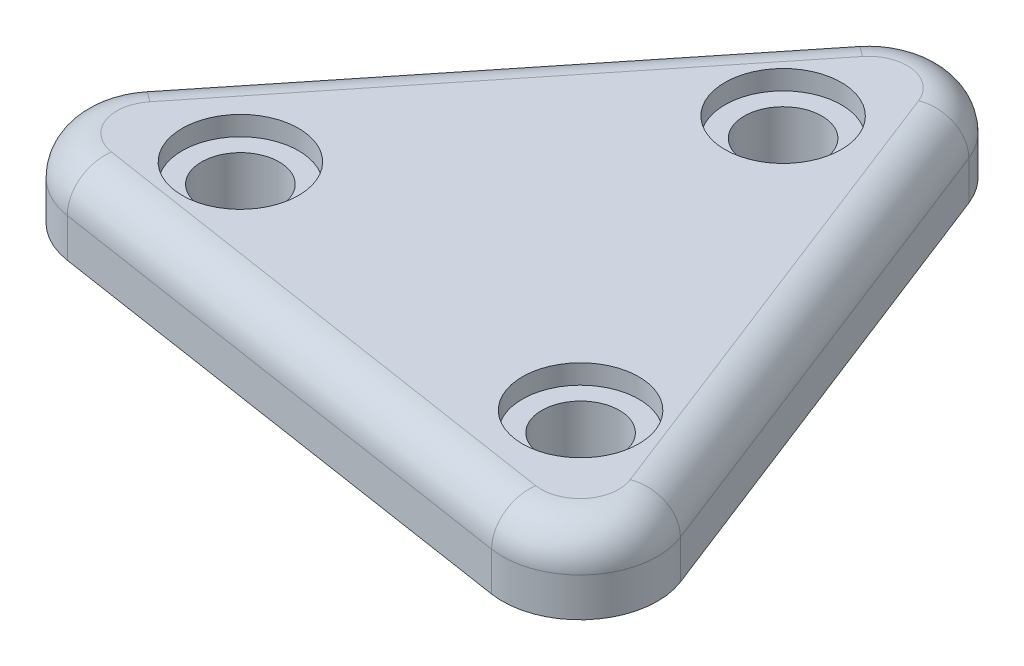
ISO-10303-21;
HEADER;
FILE_DESCRIPTION(('STEP AP214'),'2;1');
FILE_NAME('part.step','',(''),(''),'','','');
FILE_SCHEMA(('AUTOMOTIVE_DESIGN { 1 0 10303 214 1 1 1 1 }'));
ENDSEC;
DATA;
#1=APPLICATION_CONTEXT('core data for automotive mechanical design processes');
#2=APPLICATION_PROTOCOL_DEFINITION('international standard','automotive_design',2000,#1);
#3=PRODUCT_CONTEXT('',#1,'mechanical');
#4=PRODUCT('Part','Part','',(#3));
#5=PRODUCT_RELATED_PRODUCT_CATEGORY('part','',(#4));
#6=PRODUCT_DEFINITION_FORMATION('','',#4);
#7=PRODUCT_DEFINITION_CONTEXT('part definition',#1,'design');
#8=PRODUCT_DEFINITION('design','',#6,#7);
#9=PRODUCT_DEFINITION_SHAPE('','',#8);
#10=(LENGTH_UNIT() NAMED_UNIT(*) SI_UNIT(.MILLI.,.METRE.));
#11=(NAMED_UNIT(*) PLANE_ANGLE_UNIT() SI_UNIT($,.RADIAN.));
#12=(NAMED_UNIT(*) SI_UNIT($,.STERADIAN.) SOLID_ANGLE_UNIT());
#13=UNCERTAINTY_MEASURE_WITH_UNIT(LENGTH_MEASURE(1.E-05),#10,'distance_accuracy_value','');
#14=(GEOMETRIC_REPRESENTATION_CONTEXT(3) GLOBAL_UNCERTAINTY_ASSIGNED_CONTEXT((#13)) GLOBAL_UNIT_ASSIGNED_CONTEXT((#10,
#11,#12)) REPRESENTATION_CONTEXT('',''));
#15=CARTESIAN_POINT('',(0.,0.,0.));
#16=DIRECTION('',(0.,0.,1.));
#17=DIRECTION('',(1.,0.,0.));
#18=AXIS2_PLACEMENT_3D('',#15,#16,#17);
#19=CARTESIAN_POINT('',(0.670392161956381,2.,-5.7344492048078));
#20=DIRECTION('',(0.,-1.,0.));
#21=DIRECTION('',(0.,0.,-1.));
#22=AXIS2_PLACEMENT_3D('',#19,#20,#21);
#23=CYLINDRICAL_SURFACE('',#22,1.);
#24=CARTESIAN_POINT('',(0.670392161956381,0.,-5.7344492048078));
#25=DIRECTION('',(0.,1.,0.));
#26=DIRECTION('',(0.,0.,1.));
#27=AXIS2_PLACEMENT_3D('',#24,#25,#26);
#28=CIRCLE('',#27,1.);
#29=CARTESIAN_POINT('',(0.670392161956381,0.,-4.7344492048078));
#30=VERTEX_POINT('',#29);
#31=EDGE_CURVE('E140',#30,#30,#28,.T.);
#32=ORIENTED_EDGE('',*,*,#31,.F.);
#33=EDGE_LOOP('',(#32));
#34=FACE_BOUND('',#33,.T.);
#35=CARTESIAN_POINT('',(0.670392161956381,1.5,-5.7344492048078));
#36=DIRECTION('',(0.,1.,0.));
#37=DIRECTION('',(0.,0.,1.));
#38=AXIS2_PLACEMENT_3D('',#35,#36,#37);
#39=CIRCLE('',#38,1.);
#40=CARTESIAN_POINT('',(0.670392161956381,1.5,-4.7344492048078));
#41=VERTEX_POINT('',#40);
#42=EDGE_CURVE('E38',#41,#41,#39,.T.);
#43=ORIENTED_EDGE('',*,*,#42,.T.);
#44=EDGE_LOOP('',(#43));
#45=FACE_BOUND('',#44,.T.);
#46=ADVANCED_FACE('F34',(#34,#45),#23,.F.);
#47=CARTESIAN_POINT('',(4.63098260709683,2.,3.44780124515609));
#48=DIRECTION('',(0.,-1.,0.));
#49=DIRECTION('',(0.,0.,-1.));
#50=AXIS2_PLACEMENT_3D('',#47,#48,#49);
#51=CYLINDRICAL_SURFACE('',#50,1.);
#52=CARTESIAN_POINT('',(4.63098260709683,0.,3.44780124515609));
#53=DIRECTION('',(0.,1.,0.));
#54=DIRECTION('',(0.,0.,1.));
#55=AXIS2_PLACEMENT_3D('',#52,#53,#54);
#56=CIRCLE('',#55,1.);
#57=CARTESIAN_POINT('',(4.63098260709683,0.,4.44780124515609));
#58=VERTEX_POINT('',#57);
#59=EDGE_CURVE('E229',#58,#58,#56,.T.);
#60=ORIENTED_EDGE('',*,*,#59,.F.);
#61=EDGE_LOOP('',(#60));
#62=FACE_BOUND('',#61,.T.);
#63=CARTESIAN_POINT('',(4.63098260709683,1.5,3.44780124515609));
#64=DIRECTION('',(0.,1.,0.));
#65=DIRECTION('',(0.,0.,1.));
#66=AXIS2_PLACEMENT_3D('',#63,#64,#65);
#67=CIRCLE('',#66,1.);
#68=CARTESIAN_POINT('',(4.63098260709683,1.5,4.44780124515609));
#69=VERTEX_POINT('',#68);
#70=EDGE_CURVE('E193',#69,#69,#67,.T.);
#71=ORIENTED_EDGE('',*,*,#70,.T.);
#72=EDGE_LOOP('',(#71));
#73=FACE_BOUND('',#72,.T.);
#74=ADVANCED_FACE('F236',(#62,#73),#51,.F.);
#75=CARTESIAN_POINT('',(-5.30137476905322,2.,2.2866479596517));
#76=DIRECTION('',(0.,-1.,0.));
#77=DIRECTION('',(0.,0.,-1.));
#78=AXIS2_PLACEMENT_3D('',#75,#76,#77);
#79=CYLINDRICAL_SURFACE('',#78,1.);
#80=CARTESIAN_POINT('',(-5.30137476905322,0.,2.2866479596517));
#81=DIRECTION('',(0.,1.,0.));
#82=DIRECTION('',(0.,0.,1.));
#83=AXIS2_PLACEMENT_3D('',#80,#81,#82);
#84=CIRCLE('',#83,1.);
#85=CARTESIAN_POINT('',(-5.30137476905322,0.,3.2866479596517));
#86=VERTEX_POINT('',#85);
#87=EDGE_CURVE('E190',#86,#86,#84,.T.);
#88=ORIENTED_EDGE('',*,*,#87,.F.);
#89=EDGE_LOOP('',(#88));
#90=FACE_BOUND('',#89,.T.);
#91=CARTESIAN_POINT('',(-5.30137476905322,1.5,2.2866479596517));
#92=DIRECTION('',(0.,1.,0.));
#93=DIRECTION('',(0.,0.,1.));
#94=AXIS2_PLACEMENT_3D('',#91,#92,#93);
#95=CIRCLE('',#94,1.);
#96=CARTESIAN_POINT('',(-5.30137476905322,1.5,3.2866479596517));
#97=VERTEX_POINT('',#96);
#98=EDGE_CURVE('E191',#97,#97,#95,.T.);
#99=ORIENTED_EDGE('',*,*,#98,.T.);
#100=EDGE_LOOP('',(#99));
#101=FACE_BOUND('',#100,.T.);
#102=ADVANCED_FACE('F241',(#90,#101),#79,.F.);
#103=CARTESIAN_POINT('',(0.,2.,0.));
#104=DIRECTION('',(0.,1.,0.));
#105=DIRECTION('',(0.,0.,1.));
#106=AXIS2_PLACEMENT_3D('',#103,#104,#105);
#107=PLANE('',#106);
#108=CARTESIAN_POINT('',(0.670392161956381,2.,-5.7344492048078));
#109=DIRECTION('',(0.,1.,0.));
#110=DIRECTION('',(0.,0.,1.));
#111=AXIS2_PLACEMENT_3D('',#108,#109,#110);
#112=CIRCLE('',#111,1.5);
#113=CARTESIAN_POINT('',(0.670392161956381,2.,-4.2344492048078));
#114=VERTEX_POINT('',#113);
#115=EDGE_CURVE('E210',#114,#114,#112,.T.);
#116=ORIENTED_EDGE('',*,*,#115,.F.);
#117=EDGE_LOOP('',(#116));
#118=FACE_BOUND('',#117,.T.);
#119=CARTESIAN_POINT('',(-5.30137476905322,2.,2.2866479596517));
#120=DIRECTION('',(0.,1.,0.));
#121=DIRECTION('',(0.,0.,1.));
#122=AXIS2_PLACEMENT_3D('',#119,#120,#121);
#123=CIRCLE('',#122,1.5);
#124=CARTESIAN_POINT('',(-5.30137476905322,2.,3.7866479596517));
#125=VERTEX_POINT('',#124);
#126=EDGE_CURVE('E218',#125,#125,#123,.T.);
#127=ORIENTED_EDGE('',*,*,#126,.F.);
#128=EDGE_LOOP('',(#127));
#129=FACE_BOUND('',#128,.T.);
#130=CARTESIAN_POINT('',(4.63098260709683,2.,3.44780124515609));
#131=DIRECTION('',(0.,1.,0.));
#132=DIRECTION('',(0.,0.,1.));
#133=AXIS2_PLACEMENT_3D('',#130,#131,#132);
#134=CIRCLE('',#133,1.5);
#135=CARTESIAN_POINT('',(4.63098260709683,2.,4.94780124515609));
#136=VERTEX_POINT('',#135);
#137=EDGE_CURVE('E224',#136,#136,#134,.T.);
#138=ORIENTED_EDGE('',*,*,#137,.F.);
#139=EDGE_LOOP('',(#138));
#140=FACE_BOUND('',#139,.T.);
#141=DIRECTION('',(-0.625491512786433,0.,0.780230970567139));
#142=VECTOR('',#141,1.);
#143=CARTESIAN_POINT('',(-7.81258360646896,2.,2.11372492030497));
#144=LINE('',#143,#142);
#145=CARTESIAN_POINT('',(0.363714329862823,2.,-8.08529576039356));
#146=VERTEX_POINT('',#145);
#147=CARTESIAN_POINT('',(-7.81258360646896,2.,2.11372492030497));
#148=VERTEX_POINT('',#147);
#149=EDGE_CURVE('E161',#146,#148,#144,.T.);
#150=ORIENTED_EDGE('',*,*,#149,.T.);
#151=CARTESIAN_POINT('',(-7.03235263590182,2.,2.7392164330914));
#152=DIRECTION('',(0.,1.,0.));
#153=DIRECTION('',(0.,0.,1.));
#154=AXIS2_PLACEMENT_3D('',#151,#152,#153);
#155=CIRCLE('',#154,1.);
#156=CARTESIAN_POINT('',(-7.18392869054286,2.,3.72766203081515));
#157=VERTEX_POINT('',#156);
#158=EDGE_CURVE('E163',#148,#157,#155,.T.);
#159=ORIENTED_EDGE('',*,*,#158,.T.);
#160=DIRECTION('',(0.988445597723748,0.,0.15157605464104));
#161=VECTOR('',#160,1.);
#162=CARTESIAN_POINT('',(5.73683128083081,2.,5.70903341223948));
#163=LINE('',#162,#161);
#164=CARTESIAN_POINT('',(5.73683128083081,2.,5.70903341223948));
#165=VERTEX_POINT('',#164);
#166=EDGE_CURVE('E153',#157,#165,#163,.T.);
#167=ORIENTED_EDGE('',*,*,#166,.T.);
#168=CARTESIAN_POINT('',(5.88840733547185,2.,4.72058781451573));
#169=DIRECTION('',(0.,1.,0.));
#170=DIRECTION('',(0.,0.,1.));
#171=AXIS2_PLACEMENT_3D('',#168,#169,#170);
#172=CIRCLE('',#171,1.);
#173=CARTESIAN_POINT('',(6.82021436068003,2.,4.35763372957842));
#174=VERTEX_POINT('',#173);
#175=EDGE_CURVE('E155',#165,#174,#172,.T.);
#176=ORIENTED_EDGE('',*,*,#175,.T.);
#177=DIRECTION('',(-0.362954084937314,0.,-0.93180702520818));
#178=VECTOR('',#177,1.);
#179=CARTESIAN_POINT('',(2.07575232563814,2.,-7.82275833254444));
#180=LINE('',#179,#178);
#181=CARTESIAN_POINT('',(2.07575232563814,2.,-7.82275833254444));
#182=VERTEX_POINT('',#181);
#183=EDGE_CURVE('E157',#174,#182,#180,.T.);
#184=ORIENTED_EDGE('',*,*,#183,.T.);
#185=CARTESIAN_POINT('',(1.14394530042996,2.,-7.45980424760713));
#186=DIRECTION('',(0.,1.,0.));
#187=DIRECTION('',(0.,0.,1.));
#188=AXIS2_PLACEMENT_3D('',#185,#186,#187);
#189=CIRCLE('',#188,1.);
#190=EDGE_CURVE('E159',#182,#146,#189,.T.);
#191=ORIENTED_EDGE('',*,*,#190,.T.);
#192=EDGE_LOOP('',(#150,#159,#167,#176,#184,#191));
#193=FACE_BOUND('',#192,.T.);
#194=ADVANCED_FACE('F246',(#118,#129,#140,#193),#107,.T.);
#195=CARTESIAN_POINT('',(0.,0.,0.));
#196=DIRECTION('',(0.,1.,0.));
#197=DIRECTION('',(0.,0.,1.));
#198=AXIS2_PLACEMENT_3D('',#195,#196,#197);
#199=PLANE('',#198);
#200=DIRECTION('',(-0.625491512786433,0.,0.780230970567139));
#201=VECTOR('',#200,1.);
#202=CARTESIAN_POINT('',(1.75024951899413,0.,-11.4135866385021));
#203=LINE('',#202,#201);
#204=CARTESIAN_POINT('',(-0.416516640704316,0.,-8.71078727317999));
#205=VERTEX_POINT('',#204);
#206=CARTESIAN_POINT('',(-8.5928145770361,0.,1.48823340751853));
#207=VERTEX_POINT('',#206);
#208=EDGE_CURVE('E112',#205,#207,#203,.T.);
#209=ORIENTED_EDGE('',*,*,#208,.F.);
#210=CARTESIAN_POINT('',(1.14394530042996,0.,-7.45980424760713));
#211=DIRECTION('',(0.,1.,0.));
#212=DIRECTION('',(0.,0.,1.));
#213=AXIS2_PLACEMENT_3D('',#210,#211,#212);
#214=CIRCLE('',#213,2.);
#215=CARTESIAN_POINT('',(3.00755935084632,0.,-8.18571241748175));
#216=VERTEX_POINT('',#215);
#217=EDGE_CURVE('E122',#205,#216,#214,.F.);
#218=ORIENTED_EDGE('',*,*,#217,.T.);
#219=DIRECTION('',(-0.362954084937314,0.,-0.93180702520818));
#220=VECTOR('',#219,1.);
#221=CARTESIAN_POINT('',(9.0093312177404,0.,7.22255386566146));
#222=LINE('',#221,#220);
#223=CARTESIAN_POINT('',(7.75202138588821,0.,3.9946796446411));
#224=VERTEX_POINT('',#223);
#225=EDGE_CURVE('E136',#224,#216,#222,.T.);
#226=ORIENTED_EDGE('',*,*,#225,.F.);
#227=CARTESIAN_POINT('',(5.88840733547185,0.,4.72058781451573));
#228=DIRECTION('',(0.,1.,0.));
#229=DIRECTION('',(0.,0.,1.));
#230=AXIS2_PLACEMENT_3D('',#227,#228,#229);
#231=CIRCLE('',#230,2.);
#232=CARTESIAN_POINT('',(5.58525522618977,0.,6.69747900996323));
#233=VERTEX_POINT('',#232);
#234=EDGE_CURVE('E129',#224,#233,#231,.F.);
#235=ORIENTED_EDGE('',*,*,#234,.T.);
#236=DIRECTION('',(0.988445597723748,0.,0.15157605464104));
#237=VECTOR('',#236,1.);
#238=CARTESIAN_POINT('',(-10.7595807367345,0.,4.19103277284066));
#239=LINE('',#238,#237);
#240=CARTESIAN_POINT('',(-7.3355047451839,0.,4.71610762853889));
#241=VERTEX_POINT('',#240);
#242=EDGE_CURVE('E135',#241,#233,#239,.T.);
#243=ORIENTED_EDGE('',*,*,#242,.F.);
#244=CARTESIAN_POINT('',(-7.03235263590182,0.,2.7392164330914));
#245=DIRECTION('',(0.,1.,0.));
#246=DIRECTION('',(0.,0.,1.));
#247=AXIS2_PLACEMENT_3D('',#244,#245,#246);
#248=CIRCLE('',#247,2.);
#249=EDGE_CURVE('E118',#241,#207,#248,.F.);
#250=ORIENTED_EDGE('',*,*,#249,.T.);
#251=EDGE_LOOP('',(#209,#218,#226,#235,#243,#250));
#252=FACE_BOUND('',#251,.T.);
#253=ORIENTED_EDGE('',*,*,#31,.T.);
#254=EDGE_LOOP('',(#253));
#255=FACE_BOUND('',#254,.T.);
#256=ORIENTED_EDGE('',*,*,#59,.T.);
#257=EDGE_LOOP('',(#256));
#258=FACE_BOUND('',#257,.T.);
#259=ORIENTED_EDGE('',*,*,#87,.T.);
#260=EDGE_LOOP('',(#259));
#261=FACE_BOUND('',#260,.T.);
#262=ADVANCED_FACE('F131',(#252,#255,#258,#261),#199,.F.);
#263=CARTESIAN_POINT('',(9.0093312177404,2.,7.22255386566146));
#264=DIRECTION('',(-0.93180702520818,0.,0.362954084937314));
#265=DIRECTION('',(0.362954084937314,0.,0.93180702520818));
#266=AXIS2_PLACEMENT_3D('',#263,#264,#265);
#267=PLANE('',#266);
#268=DIRECTION('',(0.,-1.,0.));
#269=VECTOR('',#268,1.);
#270=CARTESIAN_POINT('',(3.00755935084632,2.,-8.18571241748175));
#271=LINE('',#270,#269);
#272=CARTESIAN_POINT('',(3.00755935084632,1.,-8.18571241748175));
#273=VERTEX_POINT('',#272);
#274=EDGE_CURVE('E124',#216,#273,#271,.F.);
#275=ORIENTED_EDGE('',*,*,#274,.T.);
#276=DIRECTION('',(-0.362954084937314,0.,-0.93180702520818));
#277=VECTOR('',#276,1.);
#278=CARTESIAN_POINT('',(7.75202138588821,1.,3.9946796446411));
#279=LINE('',#278,#277);
#280=CARTESIAN_POINT('',(7.75202138588821,1.,3.9946796446411));
#281=VERTEX_POINT('',#280);
#282=EDGE_CURVE('E58',#273,#281,#279,.F.);
#283=ORIENTED_EDGE('',*,*,#282,.T.);
#284=DIRECTION('',(0.,-1.,0.));
#285=VECTOR('',#284,1.);
#286=CARTESIAN_POINT('',(7.75202138588821,2.,3.9946796446411));
#287=LINE('',#286,#285);
#288=EDGE_CURVE('E128',#281,#224,#287,.T.);
#289=ORIENTED_EDGE('',*,*,#288,.T.);
#290=ORIENTED_EDGE('',*,*,#225,.T.);
#291=EDGE_LOOP('',(#275,#283,#289,#290));
#292=FACE_BOUND('',#291,.T.);
#293=ADVANCED_FACE('F252',(#292),#267,.F.);
#294=CARTESIAN_POINT('',(1.75024951899413,2.,-11.4135866385021));
#295=DIRECTION('',(0.780230970567139,0.,0.625491512786433));
#296=DIRECTION('',(0.625491512786433,0.,-0.780230970567139));
#297=AXIS2_PLACEMENT_3D('',#294,#295,#296);
#298=PLANE('',#297);
#299=DIRECTION('',(0.,-1.,0.));
#300=VECTOR('',#299,1.);
#301=CARTESIAN_POINT('',(-8.5928145770361,2.,1.48823340751853));
#302=LINE('',#301,#300);
#303=CARTESIAN_POINT('',(-8.5928145770361,1.,1.48823340751853));
#304=VERTEX_POINT('',#303);
#305=EDGE_CURVE('E119',#207,#304,#302,.F.);
#306=ORIENTED_EDGE('',*,*,#305,.T.);
#307=DIRECTION('',(-0.625491512786433,0.,0.780230970567139));
#308=VECTOR('',#307,1.);
#309=CARTESIAN_POINT('',(-0.416516640704315,1.,-8.71078727317999));
#310=LINE('',#309,#308);
#311=CARTESIAN_POINT('',(-0.416516640704316,1.,-8.71078727317999));
#312=VERTEX_POINT('',#311);
#313=EDGE_CURVE('E115',#304,#312,#310,.F.);
#314=ORIENTED_EDGE('',*,*,#313,.T.);
#315=DIRECTION('',(0.,-1.,0.));
#316=VECTOR('',#315,1.);
#317=CARTESIAN_POINT('',(-0.416516640704316,2.,-8.71078727317999));
#318=LINE('',#317,#316);
#319=EDGE_CURVE('E107',#312,#205,#318,.T.);
#320=ORIENTED_EDGE('',*,*,#319,.T.);
#321=ORIENTED_EDGE('',*,*,#208,.T.);
#322=EDGE_LOOP('',(#306,#314,#320,#321));
#323=FACE_BOUND('',#322,.T.);
#324=ADVANCED_FACE('F110',(#323),#298,.F.);
#325=CARTESIAN_POINT('',(-10.7595807367345,2.,4.19103277284066));
#326=DIRECTION('',(0.15157605464104,0.,-0.988445597723747));
#327=DIRECTION('',(-0.988445597723748,0.,-0.15157605464104));
#328=AXIS2_PLACEMENT_3D('',#325,#326,#327);
#329=PLANE('',#328);
#330=DIRECTION('',(0.,-1.,0.));
#331=VECTOR('',#330,1.);
#332=CARTESIAN_POINT('',(5.58525522618977,2.,6.69747900996323));
#333=LINE('',#332,#331);
#334=CARTESIAN_POINT('',(5.58525522618977,1.,6.69747900996323));
#335=VERTEX_POINT('',#334);
#336=EDGE_CURVE('E151',#233,#335,#333,.F.);
#337=ORIENTED_EDGE('',*,*,#336,.T.);
#338=DIRECTION('',(0.988445597723748,0.,0.15157605464104));
#339=VECTOR('',#338,1.);
#340=CARTESIAN_POINT('',(-7.3355047451839,1.,4.71610762853889));
#341=LINE('',#340,#339);
#342=CARTESIAN_POINT('',(-7.3355047451839,1.,4.71610762853889));
#343=VERTEX_POINT('',#342);
#344=EDGE_CURVE('E11',#335,#343,#341,.F.);
#345=ORIENTED_EDGE('',*,*,#344,.T.);
#346=DIRECTION('',(0.,-1.,0.));
#347=VECTOR('',#346,1.);
#348=CARTESIAN_POINT('',(-7.3355047451839,2.,4.71610762853889));
#349=LINE('',#348,#347);
#350=EDGE_CURVE('E149',#343,#241,#349,.T.);
#351=ORIENTED_EDGE('',*,*,#350,.T.);
#352=ORIENTED_EDGE('',*,*,#242,.T.);
#353=EDGE_LOOP('',(#337,#345,#351,#352));
#354=FACE_BOUND('',#353,.T.);
#355=ADVANCED_FACE('F253',(#354),#329,.F.);
#356=CARTESIAN_POINT('',(1.14394530042996,2.,-7.45980424760713));
#357=DIRECTION('',(0.,-1.,0.));
#358=DIRECTION('',(0.,0.,-1.));
#359=AXIS2_PLACEMENT_3D('',#356,#357,#358);
#360=CYLINDRICAL_SURFACE('',#359,2.);
#361=ORIENTED_EDGE('',*,*,#319,.F.);
#362=CARTESIAN_POINT('',(1.14394530042996,1.,-7.45980424760713));
#363=DIRECTION('',(0.,1.,0.));
#364=DIRECTION('',(0.,0.,1.));
#365=AXIS2_PLACEMENT_3D('',#362,#363,#364);
#366=CIRCLE('',#365,2.);
#367=EDGE_CURVE('E170',#312,#273,#366,.F.);
#368=ORIENTED_EDGE('',*,*,#367,.T.);
#369=ORIENTED_EDGE('',*,*,#274,.F.);
#370=ORIENTED_EDGE('',*,*,#217,.F.);
#371=EDGE_LOOP('',(#361,#368,#369,#370));
#372=FACE_BOUND('',#371,.T.);
#373=ADVANCED_FACE('F123',(#372),#360,.T.);
#374=CARTESIAN_POINT('',(5.88840733547185,2.,4.72058781451573));
#375=DIRECTION('',(0.,-1.,0.));
#376=DIRECTION('',(0.,0.,-1.));
#377=AXIS2_PLACEMENT_3D('',#374,#375,#376);
#378=CYLINDRICAL_SURFACE('',#377,2.);
#379=ORIENTED_EDGE('',*,*,#288,.F.);
#380=CARTESIAN_POINT('',(5.88840733547185,1.,4.72058781451573));
#381=DIRECTION('',(0.,1.,0.));
#382=DIRECTION('',(0.,0.,1.));
#383=AXIS2_PLACEMENT_3D('',#380,#381,#382);
#384=CIRCLE('',#383,2.);
#385=EDGE_CURVE('E43',#281,#335,#384,.F.);
#386=ORIENTED_EDGE('',*,*,#385,.T.);
#387=ORIENTED_EDGE('',*,*,#336,.F.);
#388=ORIENTED_EDGE('',*,*,#234,.F.);
#389=EDGE_LOOP('',(#379,#386,#387,#388));
#390=FACE_BOUND('',#389,.T.);
#391=ADVANCED_FACE('F263',(#390),#378,.T.);
#392=CARTESIAN_POINT('',(-7.03235263590182,2.,2.7392164330914));
#393=DIRECTION('',(0.,-1.,0.));
#394=DIRECTION('',(0.,0.,-1.));
#395=AXIS2_PLACEMENT_3D('',#392,#393,#394);
#396=CYLINDRICAL_SURFACE('',#395,2.);
#397=ORIENTED_EDGE('',*,*,#350,.F.);
#398=CARTESIAN_POINT('',(-7.03235263590182,1.,2.7392164330914));
#399=DIRECTION('',(0.,1.,0.));
#400=DIRECTION('',(0.,0.,1.));
#401=AXIS2_PLACEMENT_3D('',#398,#399,#400);
#402=CIRCLE('',#401,2.);
#403=EDGE_CURVE('E166',#343,#304,#402,.F.);
#404=ORIENTED_EDGE('',*,*,#403,.T.);
#405=ORIENTED_EDGE('',*,*,#305,.F.);
#406=ORIENTED_EDGE('',*,*,#249,.F.);
#407=EDGE_LOOP('',(#397,#404,#405,#406));
#408=FACE_BOUND('',#407,.T.);
#409=ADVANCED_FACE('F266',(#408),#396,.T.);
#410=CARTESIAN_POINT('',(4.44798334315908,1.,-1.73256230148301));
#411=DIRECTION('',(0.362954084937314,0.,0.93180702520818));
#412=DIRECTION('',(0.93180702520818,0.,-0.362954084937314));
#413=AXIS2_PLACEMENT_3D('',#410,#411,#412);
#414=CYLINDRICAL_SURFACE('',#413,1.);
#415=CARTESIAN_POINT('',(6.82021436068003,1.,4.35763372957842));
#416=DIRECTION('',(0.362954084937314,0.,0.931807025208179));
#417=DIRECTION('',(0.93180702520818,0.,-0.362954084937314));
#418=AXIS2_PLACEMENT_3D('',#415,#416,#417);
#419=CIRCLE('',#418,1.);
#420=EDGE_CURVE('E184',#281,#174,#419,.T.);
#421=ORIENTED_EDGE('',*,*,#420,.F.);
#422=ORIENTED_EDGE('',*,*,#282,.F.);
#423=CARTESIAN_POINT('',(2.07575232563814,1.,-7.82275833254444));
#424=DIRECTION('',(-0.362954084937314,0.,-0.931807025208179));
#425=DIRECTION('',(-0.93180702520818,0.,0.362954084937314));
#426=AXIS2_PLACEMENT_3D('',#423,#424,#425);
#427=CIRCLE('',#426,1.);
#428=EDGE_CURVE('E187',#182,#273,#427,.T.);
#429=ORIENTED_EDGE('',*,*,#428,.F.);
#430=ORIENTED_EDGE('',*,*,#183,.F.);
#431=EDGE_LOOP('',(#421,#422,#429,#430));
#432=FACE_BOUND('',#431,.T.);
#433=ADVANCED_FACE('F36',(#432),#414,.T.);
#434=CARTESIAN_POINT('',(1.14394530042996,1.,-7.45980424760713));
#435=DIRECTION('',(0.,1.,0.));
#436=DIRECTION('',(0.,0.,1.));
#437=AXIS2_PLACEMENT_3D('',#434,#435,#436);
#438=DEGENERATE_TOROIDAL_SURFACE('',#437,1.,1.,.T.);
#439=ORIENTED_EDGE('',*,*,#428,.T.);
#440=ORIENTED_EDGE('',*,*,#367,.F.);
#441=CARTESIAN_POINT('',(0.363714329862823,1.,-8.08529576039356));
#442=DIRECTION('',(-0.625491512786434,0.,0.780230970567138));
#443=DIRECTION('',(0.780230970567139,0.,0.625491512786434));
#444=AXIS2_PLACEMENT_3D('',#441,#442,#443);
#445=CIRCLE('',#444,1.);
#446=EDGE_CURVE('E181',#146,#312,#445,.T.);
#447=ORIENTED_EDGE('',*,*,#446,.F.);
#448=ORIENTED_EDGE('',*,*,#190,.F.);
#449=EDGE_LOOP('',(#439,#440,#447,#448));
#450=FACE_BOUND('',#449,.T.);
#451=ADVANCED_FACE('F285',(#450),#438,.T.);
#452=CARTESIAN_POINT('',(5.88840733547185,1.,4.72058781451573));
#453=DIRECTION('',(0.,1.,0.));
#454=DIRECTION('',(0.,0.,1.));
#455=AXIS2_PLACEMENT_3D('',#452,#453,#454);
#456=DEGENERATE_TOROIDAL_SURFACE('',#455,1.,1.,.T.);
#457=ORIENTED_EDGE('',*,*,#420,.T.);
#458=ORIENTED_EDGE('',*,*,#175,.F.);
#459=CARTESIAN_POINT('',(5.73683128083081,1.,5.70903341223948));
#460=DIRECTION('',(-0.988445597723748,0.,-0.151576054641039));
#461=DIRECTION('',(-0.151576054641039,0.,0.988445597723748));
#462=AXIS2_PLACEMENT_3D('',#459,#460,#461);
#463=CIRCLE('',#462,1.);
#464=EDGE_CURVE('E178',#335,#165,#463,.T.);
#465=ORIENTED_EDGE('',*,*,#464,.F.);
#466=ORIENTED_EDGE('',*,*,#385,.F.);
#467=EDGE_LOOP('',(#457,#458,#465,#466));
#468=FACE_BOUND('',#467,.T.);
#469=ADVANCED_FACE('F282',(#468),#456,.T.);
#470=CARTESIAN_POINT('',(-3.72443463830307,1.,-2.9857854200443));
#471=DIRECTION('',(0.625491512786433,0.,-0.780230970567139));
#472=DIRECTION('',(-0.780230970567139,0.,-0.625491512786433));
#473=AXIS2_PLACEMENT_3D('',#470,#471,#472);
#474=CYLINDRICAL_SURFACE('',#473,1.);
#475=ORIENTED_EDGE('',*,*,#446,.T.);
#476=ORIENTED_EDGE('',*,*,#313,.F.);
#477=CARTESIAN_POINT('',(-7.81258360646896,1.,2.11372492030497));
#478=DIRECTION('',(-0.625491512786433,0.,0.780230970567139));
#479=DIRECTION('',(0.780230970567139,0.,0.625491512786433));
#480=AXIS2_PLACEMENT_3D('',#477,#478,#479);
#481=CIRCLE('',#480,1.);
#482=EDGE_CURVE('E176',#148,#304,#481,.T.);
#483=ORIENTED_EDGE('',*,*,#482,.F.);
#484=ORIENTED_EDGE('',*,*,#149,.F.);
#485=EDGE_LOOP('',(#475,#476,#483,#484));
#486=FACE_BOUND('',#485,.T.);
#487=ADVANCED_FACE('F278',(#486),#474,.T.);
#488=CARTESIAN_POINT('',(-0.723548704856021,1.,4.71834772152731));
#489=DIRECTION('',(-0.988445597723748,0.,-0.15157605464104));
#490=DIRECTION('',(-0.15157605464104,0.,0.988445597723748));
#491=AXIS2_PLACEMENT_3D('',#488,#489,#490);
#492=CYLINDRICAL_SURFACE('',#491,1.);
#493=ORIENTED_EDGE('',*,*,#464,.T.);
#494=ORIENTED_EDGE('',*,*,#166,.F.);
#495=CARTESIAN_POINT('',(-7.18392869054286,1.,3.72766203081515));
#496=DIRECTION('',(-0.988445597723747,0.,-0.15157605464104));
#497=DIRECTION('',(-0.15157605464104,0.,0.988445597723747));
#498=AXIS2_PLACEMENT_3D('',#495,#496,#497);
#499=CIRCLE('',#498,1.);
#500=EDGE_CURVE('E174',#343,#157,#499,.T.);
#501=ORIENTED_EDGE('',*,*,#500,.F.);
#502=ORIENTED_EDGE('',*,*,#344,.F.);
#503=EDGE_LOOP('',(#493,#494,#501,#502));
#504=FACE_BOUND('',#503,.T.);
#505=ADVANCED_FACE('F274',(#504),#492,.T.);
#506=CARTESIAN_POINT('',(-7.03235263590182,1.,2.7392164330914));
#507=DIRECTION('',(0.,1.,0.));
#508=DIRECTION('',(0.,0.,1.));
#509=AXIS2_PLACEMENT_3D('',#506,#507,#508);
#510=DEGENERATE_TOROIDAL_SURFACE('',#509,1.,1.,.T.);
#511=ORIENTED_EDGE('',*,*,#482,.T.);
#512=ORIENTED_EDGE('',*,*,#403,.F.);
#513=ORIENTED_EDGE('',*,*,#500,.T.);
#514=ORIENTED_EDGE('',*,*,#158,.F.);
#515=EDGE_LOOP('',(#511,#512,#513,#514));
#516=FACE_BOUND('',#515,.T.);
#517=ADVANCED_FACE('F270',(#516),#510,.T.);
#518=CARTESIAN_POINT('',(-5.30137476905322,1.5,2.2866479596517));
#519=DIRECTION('',(0.,1.,0.));
#520=DIRECTION('',(0.,0.,1.));
#521=AXIS2_PLACEMENT_3D('',#518,#519,#520);
#522=CYLINDRICAL_SURFACE('',#521,1.5);
#523=CARTESIAN_POINT('',(-5.30137476905322,1.5,2.2866479596517));
#524=DIRECTION('',(0.,1.,0.));
#525=DIRECTION('',(0.,0.,1.));
#526=AXIS2_PLACEMENT_3D('',#523,#524,#525);
#527=CIRCLE('',#526,1.5);
#528=CARTESIAN_POINT('',(-5.30137476905322,1.5,3.7866479596517));
#529=VERTEX_POINT('',#528);
#530=EDGE_CURVE('E213',#529,#529,#527,.T.);
#531=ORIENTED_EDGE('',*,*,#530,.F.);
#532=EDGE_LOOP('',(#531));
#533=FACE_BOUND('',#532,.T.);
#534=ORIENTED_EDGE('',*,*,#126,.T.);
#535=EDGE_LOOP('',(#534));
#536=FACE_BOUND('',#535,.T.);
#537=ADVANCED_FACE('F273',(#533,#536),#522,.F.);
#538=CARTESIAN_POINT('',(-5.30137476905322,1.5,2.2866479596517));
#539=DIRECTION('',(0.,1.,0.));
#540=DIRECTION('',(0.,0.,1.));
#541=AXIS2_PLACEMENT_3D('',#538,#539,#540);
#542=PLANE('',#541);
#543=ORIENTED_EDGE('',*,*,#98,.F.);
#544=EDGE_LOOP('',(#543));
#545=FACE_BOUND('',#544,.T.);
#546=ORIENTED_EDGE('',*,*,#530,.T.);
#547=EDGE_LOOP('',(#546));
#548=FACE_BOUND('',#547,.T.);
#549=ADVANCED_FACE('F419',(#545,#548),#542,.T.);
#550=CARTESIAN_POINT('',(4.63098260709683,1.5,3.44780124515609));
#551=DIRECTION('',(0.,1.,0.));
#552=DIRECTION('',(0.,0.,1.));
#553=AXIS2_PLACEMENT_3D('',#550,#551,#552);
#554=CYLINDRICAL_SURFACE('',#553,1.5);
#555=CARTESIAN_POINT('',(4.63098260709683,1.5,3.44780124515609));
#556=DIRECTION('',(0.,1.,0.));
#557=DIRECTION('',(0.,0.,1.));
#558=AXIS2_PLACEMENT_3D('',#555,#556,#557);
#559=CIRCLE('',#558,1.5);
#560=CARTESIAN_POINT('',(4.63098260709683,1.5,4.94780124515609));
#561=VERTEX_POINT('',#560);
#562=EDGE_CURVE('E221',#561,#561,#559,.T.);
#563=ORIENTED_EDGE('',*,*,#562,.F.);
#564=EDGE_LOOP('',(#563));
#565=FACE_BOUND('',#564,.T.);
#566=ORIENTED_EDGE('',*,*,#137,.T.);
#567=EDGE_LOOP('',(#566));
#568=FACE_BOUND('',#567,.T.);
#569=ADVANCED_FACE('F426',(#565,#568),#554,.F.);
#570=CARTESIAN_POINT('',(4.63098260709683,1.5,3.44780124515609));
#571=DIRECTION('',(0.,1.,0.));
#572=DIRECTION('',(0.,0.,1.));
#573=AXIS2_PLACEMENT_3D('',#570,#571,#572);
#574=PLANE('',#573);
#575=ORIENTED_EDGE('',*,*,#70,.F.);
#576=EDGE_LOOP('',(#575));
#577=FACE_BOUND('',#576,.T.);
#578=ORIENTED_EDGE('',*,*,#562,.T.);
#579=EDGE_LOOP('',(#578));
#580=FACE_BOUND('',#579,.T.);
#581=ADVANCED_FACE('F434',(#577,#580),#574,.T.);
#582=CARTESIAN_POINT('',(0.670392161956381,1.5,-5.7344492048078));
#583=DIRECTION('',(0.,1.,0.));
#584=DIRECTION('',(0.,0.,1.));
#585=AXIS2_PLACEMENT_3D('',#582,#583,#584);
#586=CYLINDRICAL_SURFACE('',#585,1.5);
#587=CARTESIAN_POINT('',(0.670392161956381,1.5,-5.7344492048078));
#588=DIRECTION('',(0.,1.,0.));
#589=DIRECTION('',(0.,0.,1.));
#590=AXIS2_PLACEMENT_3D('',#587,#588,#589);
#591=CIRCLE('',#590,1.5);
#592=CARTESIAN_POINT('',(0.670392161956381,1.5,-4.2344492048078));
#593=VERTEX_POINT('',#592);
#594=EDGE_CURVE('E194',#593,#593,#591,.T.);
#595=ORIENTED_EDGE('',*,*,#594,.F.);
#596=EDGE_LOOP('',(#595));
#597=FACE_BOUND('',#596,.T.);
#598=ORIENTED_EDGE('',*,*,#115,.T.);
#599=EDGE_LOOP('',(#598));
#600=FACE_BOUND('',#599,.T.);
#601=ADVANCED_FACE('F205',(#597,#600),#586,.F.);
#602=CARTESIAN_POINT('',(0.670392161956381,1.5,-5.7344492048078));
#603=DIRECTION('',(0.,1.,0.));
#604=DIRECTION('',(0.,0.,1.));
#605=AXIS2_PLACEMENT_3D('',#602,#603,#604);
#606=PLANE('',#605);
#607=ORIENTED_EDGE('',*,*,#42,.F.);
#608=EDGE_LOOP('',(#607));
#609=FACE_BOUND('',#608,.T.);
#610=ORIENTED_EDGE('',*,*,#594,.T.);
#611=EDGE_LOOP('',(#610));
#612=FACE_BOUND('',#611,.T.);
#613=ADVANCED_FACE('F202',(#609,#612),#606,.T.);
#614=CLOSED_SHELL('',(#46,#74,#102,#194,#262,#293,#324,#355,#373,#391,#409,#433,#451,#469,#487,
#505,#517,#537,#549,#569,#581,#601,#613));
#615=MANIFOLD_SOLID_BREP('B2',#614);
#616=ADVANCED_BREP_SHAPE_REPRESENTATION('',(#18,#615),#14);
#617=SHAPE_DEFINITION_REPRESENTATION(#9,#616);
ENDSEC;
END-ISO-10303-21;
